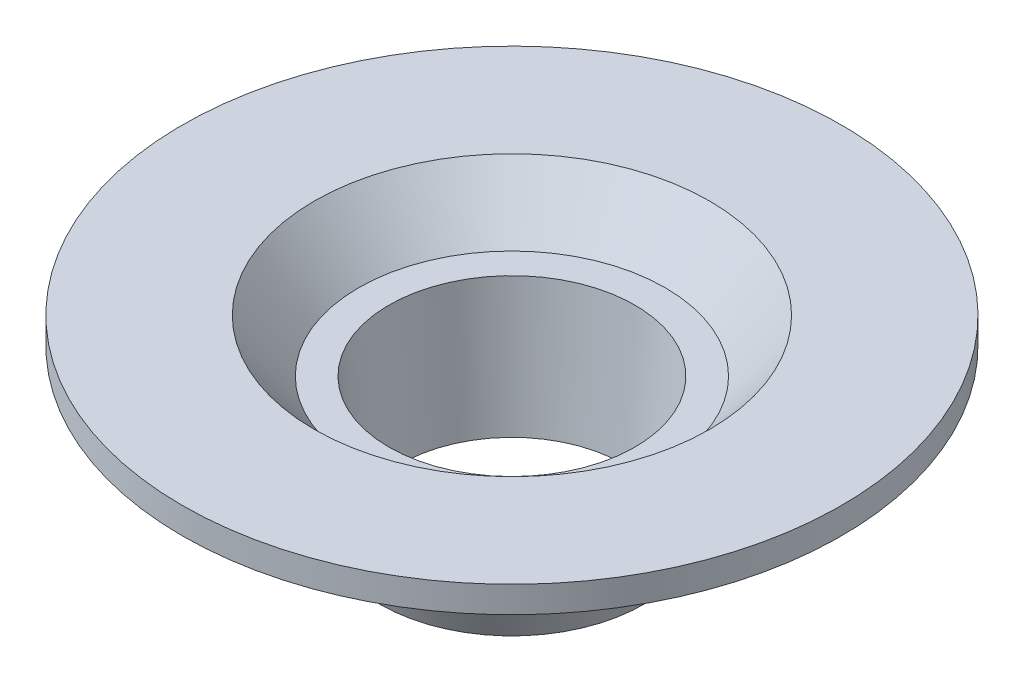
ISO-10303-21;
HEADER;
FILE_DESCRIPTION(('STEP AP214'),'2;1');
FILE_NAME('part.step','',(''),(''),'','','');
FILE_SCHEMA(('AUTOMOTIVE_DESIGN { 1 0 10303 214 1 1 1 1 }'));
ENDSEC;
DATA;
#1=APPLICATION_CONTEXT('core data for automotive mechanical design processes');
#2=APPLICATION_PROTOCOL_DEFINITION('international standard','automotive_design',2000,#1);
#3=PRODUCT_CONTEXT('',#1,'mechanical');
#4=PRODUCT('Part','Part','',(#3));
#5=PRODUCT_RELATED_PRODUCT_CATEGORY('part','',(#4));
#6=PRODUCT_DEFINITION_FORMATION('','',#4);
#7=PRODUCT_DEFINITION_CONTEXT('part definition',#1,'design');
#8=PRODUCT_DEFINITION('design','',#6,#7);
#9=PRODUCT_DEFINITION_SHAPE('','',#8);
#10=(LENGTH_UNIT() NAMED_UNIT(*) SI_UNIT(.MILLI.,.METRE.));
#11=(NAMED_UNIT(*) PLANE_ANGLE_UNIT() SI_UNIT($,.RADIAN.));
#12=(NAMED_UNIT(*) SI_UNIT($,.STERADIAN.) SOLID_ANGLE_UNIT());
#13=UNCERTAINTY_MEASURE_WITH_UNIT(LENGTH_MEASURE(1.E-05),#10,'distance_accuracy_value','');
#14=(GEOMETRIC_REPRESENTATION_CONTEXT(3) GLOBAL_UNCERTAINTY_ASSIGNED_CONTEXT((#13)) GLOBAL_UNIT_ASSIGNED_CONTEXT((#10,
#11,#12)) REPRESENTATION_CONTEXT('',''));
#15=CARTESIAN_POINT('',(0.,0.,0.));
#16=DIRECTION('',(0.,0.,1.));
#17=DIRECTION('',(1.,0.,0.));
#18=AXIS2_PLACEMENT_3D('',#15,#16,#17);
#19=CARTESIAN_POINT('',(0.,5.,0.));
#20=DIRECTION('',(0.,1.,0.));
#21=DIRECTION('',(0.,0.,1.));
#22=AXIS2_PLACEMENT_3D('',#19,#20,#21);
#23=CONICAL_SURFACE('',#22,4.66610413703536,0.0877826178591598);
#24=CARTESIAN_POINT('',(0.,0.,0.));
#25=DIRECTION('',(0.,1.,0.));
#26=DIRECTION('',(0.,0.,1.));
#27=AXIS2_PLACEMENT_3D('',#24,#25,#26);
#28=CIRCLE('',#27,4.2260601714893);
#29=CARTESIAN_POINT('',(0.,0.,4.2260601714893));
#30=VERTEX_POINT('',#29);
#31=EDGE_CURVE('E10',#30,#30,#28,.T.);
#32=ORIENTED_EDGE('',*,*,#31,.F.);
#33=EDGE_LOOP('',(#32));
#34=FACE_BOUND('',#33,.T.);
#35=CARTESIAN_POINT('',(0.,5.,0.));
#36=DIRECTION('',(0.,1.,0.));
#37=DIRECTION('',(0.,0.,1.));
#38=AXIS2_PLACEMENT_3D('',#35,#36,#37);
#39=CIRCLE('',#38,4.66610413703536);
#40=CARTESIAN_POINT('',(0.,5.,4.66610413703536));
#41=VERTEX_POINT('',#40);
#42=EDGE_CURVE('E80',#41,#41,#39,.T.);
#43=ORIENTED_EDGE('',*,*,#42,.T.);
#44=EDGE_LOOP('',(#43));
#45=FACE_BOUND('',#44,.T.);
#46=ADVANCED_FACE('F37',(#34,#45),#23,.F.);
#47=CARTESIAN_POINT('',(4.2260601714893,0.,0.));
#48=DIRECTION('',(0.,1.,0.));
#49=DIRECTION('',(0.,0.,1.));
#50=AXIS2_PLACEMENT_3D('',#47,#48,#49);
#51=PLANE('',#50);
#52=CARTESIAN_POINT('',(0.,0.,0.));
#53=DIRECTION('',(0.,1.,0.));
#54=DIRECTION('',(0.,0.,1.));
#55=AXIS2_PLACEMENT_3D('',#52,#53,#54);
#56=CIRCLE('',#55,5.);
#57=CARTESIAN_POINT('',(0.,0.,5.));
#58=VERTEX_POINT('',#57);
#59=EDGE_CURVE('E44',#58,#58,#56,.T.);
#60=ORIENTED_EDGE('',*,*,#59,.F.);
#61=EDGE_LOOP('',(#60));
#62=FACE_BOUND('',#61,.T.);
#63=ORIENTED_EDGE('',*,*,#31,.T.);
#64=EDGE_LOOP('',(#63));
#65=FACE_BOUND('',#64,.T.);
#66=ADVANCED_FACE('F130',(#62,#65),#51,.F.);
#67=CARTESIAN_POINT('',(0.,0.,0.));
#68=DIRECTION('',(0.,1.,0.));
#69=DIRECTION('',(0.,0.,1.));
#70=AXIS2_PLACEMENT_3D('',#67,#68,#69);
#71=CONICAL_SURFACE('',#70,5.,0.371485650792204);
#72=CARTESIAN_POINT('',(0.,4.,0.));
#73=DIRECTION('',(0.,1.,0.));
#74=DIRECTION('',(0.,0.,1.));
#75=AXIS2_PLACEMENT_3D('',#72,#73,#74);
#76=CIRCLE('',#75,6.55829318888338);
#77=CARTESIAN_POINT('',(0.,4.,6.55829318888338));
#78=VERTEX_POINT('',#77);
#79=EDGE_CURVE('E49',#78,#78,#76,.T.);
#80=ORIENTED_EDGE('',*,*,#79,.F.);
#81=EDGE_LOOP('',(#80));
#82=FACE_BOUND('',#81,.T.);
#83=ORIENTED_EDGE('',*,*,#59,.T.);
#84=EDGE_LOOP('',(#83));
#85=FACE_BOUND('',#84,.T.);
#86=ADVANCED_FACE('F125',(#82,#85),#71,.T.);
#87=CARTESIAN_POINT('',(6.55829318888338,4.,0.));
#88=DIRECTION('',(0.,1.,0.));
#89=DIRECTION('',(0.,0.,1.));
#90=AXIS2_PLACEMENT_3D('',#87,#88,#89);
#91=PLANE('',#90);
#92=CARTESIAN_POINT('',(0.,4.,0.));
#93=DIRECTION('',(0.,1.,0.));
#94=DIRECTION('',(0.,0.,1.));
#95=AXIS2_PLACEMENT_3D('',#92,#93,#94);
#96=CIRCLE('',#95,8.5);
#97=CARTESIAN_POINT('',(0.,4.,8.5));
#98=VERTEX_POINT('',#97);
#99=EDGE_CURVE('E54',#98,#98,#96,.T.);
#100=ORIENTED_EDGE('',*,*,#99,.F.);
#101=EDGE_LOOP('',(#100));
#102=FACE_BOUND('',#101,.T.);
#103=ORIENTED_EDGE('',*,*,#79,.T.);
#104=EDGE_LOOP('',(#103));
#105=FACE_BOUND('',#104,.T.);
#106=ADVANCED_FACE('F119',(#102,#105),#91,.F.);
#107=CARTESIAN_POINT('',(0.,4.,0.));
#108=DIRECTION('',(0.,1.,0.));
#109=DIRECTION('',(0.,0.,1.));
#110=AXIS2_PLACEMENT_3D('',#107,#108,#109);
#111=CONICAL_SURFACE('',#110,8.5,0.767764388162222);
#112=CARTESIAN_POINT('',(0.,6.,0.));
#113=DIRECTION('',(0.,1.,0.));
#114=DIRECTION('',(0.,0.,1.));
#115=AXIS2_PLACEMENT_3D('',#112,#113,#114);
#116=CIRCLE('',#115,10.4306800856886);
#117=CARTESIAN_POINT('',(0.,6.,10.4306800856886));
#118=VERTEX_POINT('',#117);
#119=EDGE_CURVE('E60',#118,#118,#116,.T.);
#120=ORIENTED_EDGE('',*,*,#119,.F.);
#121=EDGE_LOOP('',(#120));
#122=FACE_BOUND('',#121,.T.);
#123=ORIENTED_EDGE('',*,*,#99,.T.);
#124=EDGE_LOOP('',(#123));
#125=FACE_BOUND('',#124,.T.);
#126=ADVANCED_FACE('F113',(#122,#125),#111,.T.);
#127=CARTESIAN_POINT('',(10.4306800856886,6.,0.));
#128=DIRECTION('',(0.,1.,0.));
#129=DIRECTION('',(0.,0.,1.));
#130=AXIS2_PLACEMENT_3D('',#127,#128,#129);
#131=PLANE('',#130);
#132=CARTESIAN_POINT('',(0.,6.,0.));
#133=DIRECTION('',(0.,1.,0.));
#134=DIRECTION('',(0.,0.,1.));
#135=AXIS2_PLACEMENT_3D('',#132,#133,#134);
#136=CIRCLE('',#135,12.5);
#137=CARTESIAN_POINT('',(0.,6.,12.5));
#138=VERTEX_POINT('',#137);
#139=EDGE_CURVE('E64',#138,#138,#136,.T.);
#140=ORIENTED_EDGE('',*,*,#139,.F.);
#141=EDGE_LOOP('',(#140));
#142=FACE_BOUND('',#141,.T.);
#143=ORIENTED_EDGE('',*,*,#119,.T.);
#144=EDGE_LOOP('',(#143));
#145=FACE_BOUND('',#144,.T.);
#146=ADVANCED_FACE('F107',(#142,#145),#131,.F.);
#147=CARTESIAN_POINT('',(0.,14.449053436223,0.));
#148=DIRECTION('',(0.,1.,0.));
#149=DIRECTION('',(0.,0.,1.));
#150=AXIS2_PLACEMENT_3D('',#147,#148,#149);
#151=CYLINDRICAL_SURFACE('',#150,12.5);
#152=CARTESIAN_POINT('',(0.,7.,0.));
#153=DIRECTION('',(0.,1.,0.));
#154=DIRECTION('',(0.,0.,1.));
#155=AXIS2_PLACEMENT_3D('',#152,#153,#154);
#156=CIRCLE('',#155,12.5);
#157=CARTESIAN_POINT('',(0.,7.,12.5));
#158=VERTEX_POINT('',#157);
#159=EDGE_CURVE('E68',#158,#158,#156,.T.);
#160=ORIENTED_EDGE('',*,*,#159,.F.);
#161=EDGE_LOOP('',(#160));
#162=FACE_BOUND('',#161,.T.);
#163=ORIENTED_EDGE('',*,*,#139,.T.);
#164=EDGE_LOOP('',(#163));
#165=FACE_BOUND('',#164,.T.);
#166=ADVANCED_FACE('F101',(#162,#165),#151,.T.);
#167=CARTESIAN_POINT('',(12.5,7.,0.));
#168=DIRECTION('',(0.,-1.,0.));
#169=DIRECTION('',(0.,0.,-1.));
#170=AXIS2_PLACEMENT_3D('',#167,#168,#169);
#171=PLANE('',#170);
#172=CARTESIAN_POINT('',(0.,7.,0.));
#173=DIRECTION('',(0.,1.,0.));
#174=DIRECTION('',(0.,0.,1.));
#175=AXIS2_PLACEMENT_3D('',#172,#173,#174);
#176=CIRCLE('',#175,7.5);
#177=CARTESIAN_POINT('',(0.,7.,7.5));
#178=VERTEX_POINT('',#177);
#179=EDGE_CURVE('E72',#178,#178,#176,.T.);
#180=ORIENTED_EDGE('',*,*,#179,.F.);
#181=EDGE_LOOP('',(#180));
#182=FACE_BOUND('',#181,.T.);
#183=ORIENTED_EDGE('',*,*,#159,.T.);
#184=EDGE_LOOP('',(#183));
#185=FACE_BOUND('',#184,.T.);
#186=ADVANCED_FACE('F95',(#182,#185),#171,.F.);
#187=CARTESIAN_POINT('',(0.,7.,0.));
#188=DIRECTION('',(0.,1.,0.));
#189=DIRECTION('',(0.,0.,1.));
#190=AXIS2_PLACEMENT_3D('',#187,#188,#189);
#191=CONICAL_SURFACE('',#190,7.5,0.701520408055622);
#192=CARTESIAN_POINT('',(0.,5.,0.));
#193=DIRECTION('',(0.,1.,0.));
#194=DIRECTION('',(0.,0.,1.));
#195=AXIS2_PLACEMENT_3D('',#192,#193,#194);
#196=CIRCLE('',#195,5.81021844745509);
#197=CARTESIAN_POINT('',(0.,5.,5.81021844745509));
#198=VERTEX_POINT('',#197);
#199=EDGE_CURVE('E76',#198,#198,#196,.T.);
#200=ORIENTED_EDGE('',*,*,#199,.F.);
#201=EDGE_LOOP('',(#200));
#202=FACE_BOUND('',#201,.T.);
#203=ORIENTED_EDGE('',*,*,#179,.T.);
#204=EDGE_LOOP('',(#203));
#205=FACE_BOUND('',#204,.T.);
#206=ADVANCED_FACE('F89',(#202,#205),#191,.F.);
#207=CARTESIAN_POINT('',(5.81021844745509,5.,0.));
#208=DIRECTION('',(0.,-1.,0.));
#209=DIRECTION('',(0.,0.,-1.));
#210=AXIS2_PLACEMENT_3D('',#207,#208,#209);
#211=PLANE('',#210);
#212=ORIENTED_EDGE('',*,*,#42,.F.);
#213=EDGE_LOOP('',(#212));
#214=FACE_BOUND('',#213,.T.);
#215=ORIENTED_EDGE('',*,*,#199,.T.);
#216=EDGE_LOOP('',(#215));
#217=FACE_BOUND('',#216,.T.);
#218=ADVANCED_FACE('F86',(#214,#217),#211,.F.);
#219=CLOSED_SHELL('',(#46,#66,#86,#106,#126,#146,#166,#186,#206,#218));
#220=MANIFOLD_SOLID_BREP('B2',#219);
#221=ADVANCED_BREP_SHAPE_REPRESENTATION('',(#18,#220),#14);
#222=SHAPE_DEFINITION_REPRESENTATION(#9,#221);
ENDSEC;
END-ISO-10303-21;
